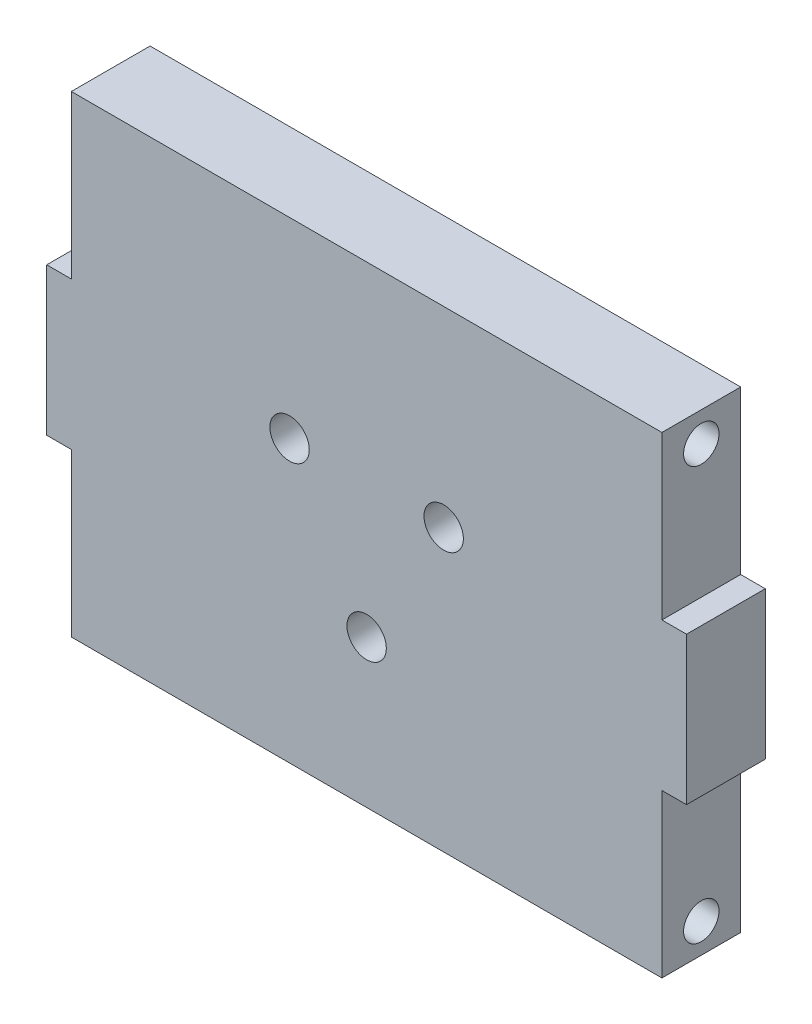
ISO-10303-21;
HEADER;
FILE_DESCRIPTION(('STEP AP214'),'2;1');
FILE_NAME('part.step','',(''),(''),'','','');
FILE_SCHEMA(('AUTOMOTIVE_DESIGN { 1 0 10303 214 1 1 1 1 }'));
ENDSEC;
DATA;
#1=APPLICATION_CONTEXT('core data for automotive mechanical design processes');
#2=APPLICATION_PROTOCOL_DEFINITION('international standard','automotive_design',2000,#1);
#3=PRODUCT_CONTEXT('',#1,'mechanical');
#4=PRODUCT('Part','Part','',(#3));
#5=PRODUCT_RELATED_PRODUCT_CATEGORY('part','',(#4));
#6=PRODUCT_DEFINITION_FORMATION('','',#4);
#7=PRODUCT_DEFINITION_CONTEXT('part definition',#1,'design');
#8=PRODUCT_DEFINITION('design','',#6,#7);
#9=PRODUCT_DEFINITION_SHAPE('','',#8);
#10=(LENGTH_UNIT() NAMED_UNIT(*) SI_UNIT(.MILLI.,.METRE.));
#11=(NAMED_UNIT(*) PLANE_ANGLE_UNIT() SI_UNIT($,.RADIAN.));
#12=(NAMED_UNIT(*) SI_UNIT($,.STERADIAN.) SOLID_ANGLE_UNIT());
#13=UNCERTAINTY_MEASURE_WITH_UNIT(LENGTH_MEASURE(1.E-05),#10,'distance_accuracy_value','');
#14=(GEOMETRIC_REPRESENTATION_CONTEXT(3) GLOBAL_UNCERTAINTY_ASSIGNED_CONTEXT((#13)) GLOBAL_UNIT_ASSIGNED_CONTEXT((#10,
#11,#12)) REPRESENTATION_CONTEXT('',''));
#15=CARTESIAN_POINT('',(0.,0.,0.));
#16=DIRECTION('',(0.,0.,1.));
#17=DIRECTION('',(1.,0.,0.));
#18=AXIS2_PLACEMENT_3D('',#15,#16,#17);
#19=CARTESIAN_POINT('',(-30.,24.,8.));
#20=DIRECTION('',(1.,0.,0.));
#21=DIRECTION('',(0.,1.,0.));
#22=AXIS2_PLACEMENT_3D('',#19,#20,#21);
#23=PLANE('',#22);
#24=CARTESIAN_POINT('',(-30.,-21.,4.));
#25=DIRECTION('',(-1.,0.,0.));
#26=DIRECTION('',(0.,-1.,0.));
#27=AXIS2_PLACEMENT_3D('',#24,#25,#26);
#28=CIRCLE('',#27,1.8);
#29=CARTESIAN_POINT('',(-30.,-22.8,4.));
#30=VERTEX_POINT('',#29);
#31=EDGE_CURVE('E290',#30,#30,#28,.T.);
#32=ORIENTED_EDGE('',*,*,#31,.F.);
#33=EDGE_LOOP('',(#32));
#34=FACE_BOUND('',#33,.T.);
#35=DIRECTION('',(0.,-1.,0.));
#36=VECTOR('',#35,1.);
#37=CARTESIAN_POINT('',(-30.,24.,8.));
#38=LINE('',#37,#36);
#39=CARTESIAN_POINT('',(-30.,-7.5,8.));
#40=VERTEX_POINT('',#39);
#41=CARTESIAN_POINT('',(-30.,-24.,8.));
#42=VERTEX_POINT('',#41);
#43=EDGE_CURVE('E202',#40,#42,#38,.T.);
#44=ORIENTED_EDGE('',*,*,#43,.F.);
#45=DIRECTION('',(0.,0.,-1.));
#46=VECTOR('',#45,1.);
#47=CARTESIAN_POINT('',(-30.,-7.5,8.));
#48=LINE('',#47,#46);
#49=CARTESIAN_POINT('',(-30.,-7.5,0.));
#50=VERTEX_POINT('',#49);
#51=EDGE_CURVE('E194',#40,#50,#48,.T.);
#52=ORIENTED_EDGE('',*,*,#51,.T.);
#53=DIRECTION('',(0.,-1.,0.));
#54=VECTOR('',#53,1.);
#55=CARTESIAN_POINT('',(-30.,24.,0.));
#56=LINE('',#55,#54);
#57=CARTESIAN_POINT('',(-30.,-24.,0.));
#58=VERTEX_POINT('',#57);
#59=EDGE_CURVE('E197',#50,#58,#56,.T.);
#60=ORIENTED_EDGE('',*,*,#59,.T.);
#61=DIRECTION('',(0.,0.,-1.));
#62=VECTOR('',#61,1.);
#63=CARTESIAN_POINT('',(-30.,-24.,8.));
#64=LINE('',#63,#62);
#65=EDGE_CURVE('E11',#42,#58,#64,.T.);
#66=ORIENTED_EDGE('',*,*,#65,.F.);
#67=EDGE_LOOP('',(#44,#52,#60,#66));
#68=FACE_BOUND('',#67,.T.);
#69=ADVANCED_FACE('F44',(#34,#68),#23,.F.);
#70=CARTESIAN_POINT('',(30.,24.,8.));
#71=DIRECTION('',(1.,0.,0.));
#72=DIRECTION('',(0.,1.,0.));
#73=AXIS2_PLACEMENT_3D('',#70,#71,#72);
#74=PLANE('',#73);
#75=CARTESIAN_POINT('',(30.,-21.,4.));
#76=DIRECTION('',(-1.,0.,0.));
#77=DIRECTION('',(0.,-1.,0.));
#78=AXIS2_PLACEMENT_3D('',#75,#76,#77);
#79=CIRCLE('',#78,1.8);
#80=CARTESIAN_POINT('',(30.,-22.8,4.));
#81=VERTEX_POINT('',#80);
#82=EDGE_CURVE('E287',#81,#81,#79,.T.);
#83=ORIENTED_EDGE('',*,*,#82,.T.);
#84=EDGE_LOOP('',(#83));
#85=FACE_BOUND('',#84,.T.);
#86=DIRECTION('',(0.,0.,-1.));
#87=VECTOR('',#86,1.);
#88=CARTESIAN_POINT('',(30.,-7.5,8.));
#89=LINE('',#88,#87);
#90=CARTESIAN_POINT('',(30.,-7.5,8.));
#91=VERTEX_POINT('',#90);
#92=CARTESIAN_POINT('',(30.,-7.5,0.));
#93=VERTEX_POINT('',#92);
#94=EDGE_CURVE('E191',#91,#93,#89,.T.);
#95=ORIENTED_EDGE('',*,*,#94,.F.);
#96=DIRECTION('',(0.,-1.,0.));
#97=VECTOR('',#96,1.);
#98=CARTESIAN_POINT('',(30.,24.,8.));
#99=LINE('',#98,#97);
#100=CARTESIAN_POINT('',(30.,-24.,8.));
#101=VERTEX_POINT('',#100);
#102=EDGE_CURVE('E205',#91,#101,#99,.T.);
#103=ORIENTED_EDGE('',*,*,#102,.T.);
#104=DIRECTION('',(0.,0.,-1.));
#105=VECTOR('',#104,1.);
#106=CARTESIAN_POINT('',(30.,-24.,8.));
#107=LINE('',#106,#105);
#108=CARTESIAN_POINT('',(30.,-24.,0.));
#109=VERTEX_POINT('',#108);
#110=EDGE_CURVE('E52',#101,#109,#107,.T.);
#111=ORIENTED_EDGE('',*,*,#110,.T.);
#112=DIRECTION('',(0.,-1.,0.));
#113=VECTOR('',#112,1.);
#114=CARTESIAN_POINT('',(30.,24.,0.));
#115=LINE('',#114,#113);
#116=EDGE_CURVE('E217',#93,#109,#115,.T.);
#117=ORIENTED_EDGE('',*,*,#116,.F.);
#118=EDGE_LOOP('',(#95,#103,#111,#117));
#119=FACE_BOUND('',#118,.T.);
#120=ADVANCED_FACE('F227',(#85,#119),#74,.T.);
#121=CARTESIAN_POINT('',(-30.,21.,4.));
#122=DIRECTION('',(1.,0.,0.));
#123=DIRECTION('',(0.,1.,0.));
#124=AXIS2_PLACEMENT_3D('',#121,#122,#123);
#125=CIRCLE('',#124,1.8);
#126=CARTESIAN_POINT('',(-30.,22.8,4.));
#127=VERTEX_POINT('',#126);
#128=EDGE_CURVE('E281',#127,#127,#125,.T.);
#129=ORIENTED_EDGE('',*,*,#128,.T.);
#130=EDGE_LOOP('',(#129));
#131=FACE_BOUND('',#130,.T.);
#132=CARTESIAN_POINT('',(-30.,24.,0.));
#133=VERTEX_POINT('',#132);
#134=CARTESIAN_POINT('',(-30.,7.5,0.));
#135=VERTEX_POINT('',#134);
#136=EDGE_CURVE('E211',#133,#135,#56,.T.);
#137=ORIENTED_EDGE('',*,*,#136,.T.);
#138=DIRECTION('',(0.,0.,1.));
#139=VECTOR('',#138,1.);
#140=CARTESIAN_POINT('',(-30.,7.5,8.));
#141=LINE('',#140,#139);
#142=CARTESIAN_POINT('',(-30.,7.5,8.));
#143=VERTEX_POINT('',#142);
#144=EDGE_CURVE('E188',#135,#143,#141,.T.);
#145=ORIENTED_EDGE('',*,*,#144,.T.);
#146=CARTESIAN_POINT('',(-30.,24.,8.));
#147=VERTEX_POINT('',#146);
#148=EDGE_CURVE('E198',#147,#143,#38,.T.);
#149=ORIENTED_EDGE('',*,*,#148,.F.);
#150=DIRECTION('',(0.,0.,-1.));
#151=VECTOR('',#150,1.);
#152=CARTESIAN_POINT('',(-30.,24.,8.));
#153=LINE('',#152,#151);
#154=EDGE_CURVE('E210',#147,#133,#153,.T.);
#155=ORIENTED_EDGE('',*,*,#154,.T.);
#156=EDGE_LOOP('',(#137,#145,#149,#155));
#157=FACE_BOUND('',#156,.T.);
#158=ADVANCED_FACE('F46',(#131,#157),#23,.F.);
#159=CARTESIAN_POINT('',(-30.,-24.,8.));
#160=DIRECTION('',(0.,1.,0.));
#161=DIRECTION('',(0.,0.,1.));
#162=AXIS2_PLACEMENT_3D('',#159,#160,#161);
#163=PLANE('',#162);
#164=DIRECTION('',(1.,0.,0.));
#165=VECTOR('',#164,1.);
#166=CARTESIAN_POINT('',(-30.,-24.,0.));
#167=LINE('',#166,#165);
#168=EDGE_CURVE('E214',#58,#109,#167,.T.);
#169=ORIENTED_EDGE('',*,*,#168,.T.);
#170=ORIENTED_EDGE('',*,*,#110,.F.);
#171=DIRECTION('',(1.,0.,0.));
#172=VECTOR('',#171,1.);
#173=CARTESIAN_POINT('',(-30.,-24.,8.));
#174=LINE('',#173,#172);
#175=EDGE_CURVE('E201',#42,#101,#174,.T.);
#176=ORIENTED_EDGE('',*,*,#175,.F.);
#177=ORIENTED_EDGE('',*,*,#65,.T.);
#178=EDGE_LOOP('',(#169,#170,#176,#177));
#179=FACE_BOUND('',#178,.T.);
#180=ADVANCED_FACE('F231',(#179),#163,.F.);
#181=CARTESIAN_POINT('',(30.,21.,4.));
#182=DIRECTION('',(1.,0.,0.));
#183=DIRECTION('',(0.,1.,0.));
#184=AXIS2_PLACEMENT_3D('',#181,#182,#183);
#185=CIRCLE('',#184,1.8);
#186=CARTESIAN_POINT('',(30.,22.8,4.));
#187=VERTEX_POINT('',#186);
#188=EDGE_CURVE('E297',#187,#187,#185,.T.);
#189=ORIENTED_EDGE('',*,*,#188,.F.);
#190=EDGE_LOOP('',(#189));
#191=FACE_BOUND('',#190,.T.);
#192=DIRECTION('',(0.,0.,1.));
#193=VECTOR('',#192,1.);
#194=CARTESIAN_POINT('',(30.,7.5,8.));
#195=LINE('',#194,#193);
#196=CARTESIAN_POINT('',(30.,7.5,0.));
#197=VERTEX_POINT('',#196);
#198=CARTESIAN_POINT('',(30.,7.5,8.));
#199=VERTEX_POINT('',#198);
#200=EDGE_CURVE('E182',#197,#199,#195,.T.);
#201=ORIENTED_EDGE('',*,*,#200,.F.);
#202=CARTESIAN_POINT('',(30.,24.,0.));
#203=VERTEX_POINT('',#202);
#204=EDGE_CURVE('E155',#203,#197,#115,.T.);
#205=ORIENTED_EDGE('',*,*,#204,.F.);
#206=DIRECTION('',(0.,0.,-1.));
#207=VECTOR('',#206,1.);
#208=CARTESIAN_POINT('',(30.,24.,8.));
#209=LINE('',#208,#207);
#210=CARTESIAN_POINT('',(30.,24.,8.));
#211=VERTEX_POINT('',#210);
#212=EDGE_CURVE('E222',#211,#203,#209,.T.);
#213=ORIENTED_EDGE('',*,*,#212,.F.);
#214=EDGE_CURVE('E59',#211,#199,#99,.T.);
#215=ORIENTED_EDGE('',*,*,#214,.T.);
#216=EDGE_LOOP('',(#201,#205,#213,#215));
#217=FACE_BOUND('',#216,.T.);
#218=ADVANCED_FACE('F258',(#191,#217),#74,.T.);
#219=CARTESIAN_POINT('',(-30.,24.,8.));
#220=DIRECTION('',(0.,1.,0.));
#221=DIRECTION('',(-1.,0.,0.));
#222=AXIS2_PLACEMENT_3D('',#219,#220,#221);
#223=PLANE('',#222);
#224=DIRECTION('',(1.,0.,0.));
#225=VECTOR('',#224,1.);
#226=CARTESIAN_POINT('',(-30.,24.,0.));
#227=LINE('',#226,#225);
#228=EDGE_CURVE('E219',#133,#203,#227,.T.);
#229=ORIENTED_EDGE('',*,*,#228,.F.);
#230=ORIENTED_EDGE('',*,*,#154,.F.);
#231=DIRECTION('',(1.,0.,0.));
#232=VECTOR('',#231,1.);
#233=CARTESIAN_POINT('',(-30.,24.,8.));
#234=LINE('',#233,#232);
#235=EDGE_CURVE('E207',#147,#211,#234,.T.);
#236=ORIENTED_EDGE('',*,*,#235,.T.);
#237=ORIENTED_EDGE('',*,*,#212,.T.);
#238=EDGE_LOOP('',(#229,#230,#236,#237));
#239=FACE_BOUND('',#238,.T.);
#240=ADVANCED_FACE('F257',(#239),#223,.T.);
#241=CARTESIAN_POINT('',(0.,0.,8.));
#242=DIRECTION('',(0.,0.,1.));
#243=DIRECTION('',(1.,0.,0.));
#244=AXIS2_PLACEMENT_3D('',#241,#242,#243);
#245=PLANE('',#244);
#246=CARTESIAN_POINT('',(7.82751576233718,4.55765499741428,8.));
#247=DIRECTION('',(0.,0.,1.));
#248=DIRECTION('',(-0.500000000000004,0.866025403784436,0.));
#249=AXIS2_PLACEMENT_3D('',#246,#247,#248);
#250=CIRCLE('',#249,2.);
#251=CARTESIAN_POINT('',(6.82751576233717,6.28970580498315,8.));
#252=VERTEX_POINT('',#251);
#253=EDGE_CURVE('E309',#252,#252,#250,.T.);
#254=ORIENTED_EDGE('',*,*,#253,.F.);
#255=EDGE_LOOP('',(#254));
#256=FACE_BOUND('',#255,.T.);
#257=CARTESIAN_POINT('',(-7.82751576233722,4.55765499741418,8.));
#258=DIRECTION('',(0.,0.,1.));
#259=DIRECTION('',(-0.499999999999992,-0.866025403784443,0.));
#260=AXIS2_PLACEMENT_3D('',#257,#258,#259);
#261=CIRCLE('',#260,2.);
#262=CARTESIAN_POINT('',(-8.8275157623372,2.82560418984529,8.));
#263=VERTEX_POINT('',#262);
#264=EDGE_CURVE('E303',#263,#263,#261,.T.);
#265=ORIENTED_EDGE('',*,*,#264,.F.);
#266=EDGE_LOOP('',(#265));
#267=FACE_BOUND('',#266,.T.);
#268=CARTESIAN_POINT('',(0.,-9.,8.));
#269=DIRECTION('',(0.,0.,1.));
#270=DIRECTION('',(1.,0.,0.));
#271=AXIS2_PLACEMENT_3D('',#268,#269,#270);
#272=CIRCLE('',#271,2.);
#273=CARTESIAN_POINT('',(2.,-9.,8.));
#274=VERTEX_POINT('',#273);
#275=EDGE_CURVE('E167',#274,#274,#272,.T.);
#276=ORIENTED_EDGE('',*,*,#275,.F.);
#277=EDGE_LOOP('',(#276));
#278=FACE_BOUND('',#277,.T.);
#279=ORIENTED_EDGE('',*,*,#148,.T.);
#280=DIRECTION('',(-1.,0.,0.));
#281=VECTOR('',#280,1.);
#282=CARTESIAN_POINT('',(-32.5,7.5,8.));
#283=LINE('',#282,#281);
#284=CARTESIAN_POINT('',(-32.5,7.5,8.));
#285=VERTEX_POINT('',#284);
#286=EDGE_CURVE('E176',#143,#285,#283,.T.);
#287=ORIENTED_EDGE('',*,*,#286,.T.);
#288=DIRECTION('',(0.,-1.,0.));
#289=VECTOR('',#288,1.);
#290=CARTESIAN_POINT('',(-32.5,7.5,8.));
#291=LINE('',#290,#289);
#292=CARTESIAN_POINT('',(-32.5,-7.5,8.));
#293=VERTEX_POINT('',#292);
#294=EDGE_CURVE('E179',#285,#293,#291,.T.);
#295=ORIENTED_EDGE('',*,*,#294,.T.);
#296=DIRECTION('',(1.,0.,0.));
#297=VECTOR('',#296,1.);
#298=CARTESIAN_POINT('',(-32.5,-7.5,8.));
#299=LINE('',#298,#297);
#300=EDGE_CURVE('E67',#293,#40,#299,.T.);
#301=ORIENTED_EDGE('',*,*,#300,.T.);
#302=ORIENTED_EDGE('',*,*,#43,.T.);
#303=ORIENTED_EDGE('',*,*,#175,.T.);
#304=ORIENTED_EDGE('',*,*,#102,.F.);
#305=CARTESIAN_POINT('',(32.5,-7.5,8.));
#306=VERTEX_POINT('',#305);
#307=EDGE_CURVE('E164',#91,#306,#299,.T.);
#308=ORIENTED_EDGE('',*,*,#307,.T.);
#309=DIRECTION('',(0.,1.,0.));
#310=VECTOR('',#309,1.);
#311=CARTESIAN_POINT('',(32.5,7.5,8.));
#312=LINE('',#311,#310);
#313=CARTESIAN_POINT('',(32.5,7.5,8.));
#314=VERTEX_POINT('',#313);
#315=EDGE_CURVE('E174',#306,#314,#312,.T.);
#316=ORIENTED_EDGE('',*,*,#315,.T.);
#317=EDGE_CURVE('E139',#314,#199,#283,.T.);
#318=ORIENTED_EDGE('',*,*,#317,.T.);
#319=ORIENTED_EDGE('',*,*,#214,.F.);
#320=ORIENTED_EDGE('',*,*,#235,.F.);
#321=EDGE_LOOP('',(#279,#287,#295,#301,#302,#303,#304,#308,#316,#318,#319,#320));
#322=FACE_BOUND('',#321,.T.);
#323=ADVANCED_FACE('F238',(#256,#267,#278,#322),#245,.T.);
#324=CARTESIAN_POINT('',(0.,0.,0.));
#325=DIRECTION('',(0.,0.,1.));
#326=DIRECTION('',(1.,0.,0.));
#327=AXIS2_PLACEMENT_3D('',#324,#325,#326);
#328=PLANE('',#327);
#329=CARTESIAN_POINT('',(7.82751576233718,4.55765499741428,0.));
#330=DIRECTION('',(0.,0.,1.));
#331=DIRECTION('',(-0.500000000000004,0.866025403784436,0.));
#332=AXIS2_PLACEMENT_3D('',#329,#330,#331);
#333=CIRCLE('',#332,2.);
#334=CARTESIAN_POINT('',(6.82751576233717,6.28970580498315,0.));
#335=VERTEX_POINT('',#334);
#336=EDGE_CURVE('E306',#335,#335,#333,.T.);
#337=ORIENTED_EDGE('',*,*,#336,.T.);
#338=EDGE_LOOP('',(#337));
#339=FACE_BOUND('',#338,.T.);
#340=CARTESIAN_POINT('',(-7.82751576233722,4.55765499741418,0.));
#341=DIRECTION('',(0.,0.,1.));
#342=DIRECTION('',(-0.499999999999992,-0.866025403784443,0.));
#343=AXIS2_PLACEMENT_3D('',#340,#341,#342);
#344=CIRCLE('',#343,2.);
#345=CARTESIAN_POINT('',(-8.8275157623372,2.82560418984529,0.));
#346=VERTEX_POINT('',#345);
#347=EDGE_CURVE('E312',#346,#346,#344,.T.);
#348=ORIENTED_EDGE('',*,*,#347,.T.);
#349=EDGE_LOOP('',(#348));
#350=FACE_BOUND('',#349,.T.);
#351=CARTESIAN_POINT('',(0.,-9.,0.));
#352=DIRECTION('',(0.,0.,1.));
#353=DIRECTION('',(1.,0.,0.));
#354=AXIS2_PLACEMENT_3D('',#351,#352,#353);
#355=CIRCLE('',#354,2.);
#356=CARTESIAN_POINT('',(2.,-9.,0.));
#357=VERTEX_POINT('',#356);
#358=EDGE_CURVE('E177',#357,#357,#355,.T.);
#359=ORIENTED_EDGE('',*,*,#358,.T.);
#360=EDGE_LOOP('',(#359));
#361=FACE_BOUND('',#360,.T.);
#362=ORIENTED_EDGE('',*,*,#204,.T.);
#363=DIRECTION('',(-1.,0.,0.));
#364=VECTOR('',#363,1.);
#365=CARTESIAN_POINT('',(-32.5,7.5,0.));
#366=LINE('',#365,#364);
#367=CARTESIAN_POINT('',(32.5,7.5,0.));
#368=VERTEX_POINT('',#367);
#369=EDGE_CURVE('E137',#368,#197,#366,.T.);
#370=ORIENTED_EDGE('',*,*,#369,.F.);
#371=DIRECTION('',(0.,1.,0.));
#372=VECTOR('',#371,1.);
#373=CARTESIAN_POINT('',(32.5,7.5,0.));
#374=LINE('',#373,#372);
#375=CARTESIAN_POINT('',(32.5,-7.5,0.));
#376=VERTEX_POINT('',#375);
#377=EDGE_CURVE('E152',#376,#368,#374,.T.);
#378=ORIENTED_EDGE('',*,*,#377,.F.);
#379=DIRECTION('',(1.,0.,0.));
#380=VECTOR('',#379,1.);
#381=CARTESIAN_POINT('',(-32.5,-7.5,0.));
#382=LINE('',#381,#380);
#383=EDGE_CURVE('E172',#93,#376,#382,.T.);
#384=ORIENTED_EDGE('',*,*,#383,.F.);
#385=ORIENTED_EDGE('',*,*,#116,.T.);
#386=ORIENTED_EDGE('',*,*,#168,.F.);
#387=ORIENTED_EDGE('',*,*,#59,.F.);
#388=CARTESIAN_POINT('',(-32.5,-7.5,0.));
#389=VERTEX_POINT('',#388);
#390=EDGE_CURVE('E145',#389,#50,#382,.T.);
#391=ORIENTED_EDGE('',*,*,#390,.F.);
#392=DIRECTION('',(0.,-1.,0.));
#393=VECTOR('',#392,1.);
#394=CARTESIAN_POINT('',(-32.5,7.5,0.));
#395=LINE('',#394,#393);
#396=CARTESIAN_POINT('',(-32.5,7.5,0.));
#397=VERTEX_POINT('',#396);
#398=EDGE_CURVE('E156',#397,#389,#395,.T.);
#399=ORIENTED_EDGE('',*,*,#398,.F.);
#400=EDGE_CURVE('E157',#135,#397,#366,.T.);
#401=ORIENTED_EDGE('',*,*,#400,.F.);
#402=ORIENTED_EDGE('',*,*,#136,.F.);
#403=ORIENTED_EDGE('',*,*,#228,.T.);
#404=EDGE_LOOP('',(#362,#370,#378,#384,#385,#386,#387,#391,#399,#401,#402,#403));
#405=FACE_BOUND('',#404,.T.);
#406=ADVANCED_FACE('F150',(#339,#350,#361,#405),#328,.F.);
#407=CARTESIAN_POINT('',(32.5,7.5,0.));
#408=DIRECTION('',(1.,0.,0.));
#409=DIRECTION('',(0.,0.,-1.));
#410=AXIS2_PLACEMENT_3D('',#407,#408,#409);
#411=PLANE('',#410);
#412=ORIENTED_EDGE('',*,*,#315,.F.);
#413=DIRECTION('',(0.,0.,1.));
#414=VECTOR('',#413,1.);
#415=CARTESIAN_POINT('',(32.5,-7.5,0.));
#416=LINE('',#415,#414);
#417=EDGE_CURVE('E162',#376,#306,#416,.T.);
#418=ORIENTED_EDGE('',*,*,#417,.F.);
#419=ORIENTED_EDGE('',*,*,#377,.T.);
#420=DIRECTION('',(0.,0.,1.));
#421=VECTOR('',#420,1.);
#422=CARTESIAN_POINT('',(32.5,7.5,0.));
#423=LINE('',#422,#421);
#424=EDGE_CURVE('E134',#368,#314,#423,.T.);
#425=ORIENTED_EDGE('',*,*,#424,.T.);
#426=EDGE_LOOP('',(#412,#418,#419,#425));
#427=FACE_BOUND('',#426,.T.);
#428=ADVANCED_FACE('F160',(#427),#411,.T.);
#429=CARTESIAN_POINT('',(-32.5,7.5,0.));
#430=DIRECTION('',(0.,1.,0.));
#431=DIRECTION('',(0.,0.,1.));
#432=AXIS2_PLACEMENT_3D('',#429,#430,#431);
#433=PLANE('',#432);
#434=ORIENTED_EDGE('',*,*,#369,.T.);
#435=ORIENTED_EDGE('',*,*,#200,.T.);
#436=ORIENTED_EDGE('',*,*,#317,.F.);
#437=ORIENTED_EDGE('',*,*,#424,.F.);
#438=EDGE_LOOP('',(#434,#435,#436,#437));
#439=FACE_BOUND('',#438,.T.);
#440=ADVANCED_FACE('F136',(#439),#433,.T.);
#441=CARTESIAN_POINT('',(-32.5,-7.5,0.));
#442=DIRECTION('',(0.,-1.,0.));
#443=DIRECTION('',(0.,0.,-1.));
#444=AXIS2_PLACEMENT_3D('',#441,#442,#443);
#445=PLANE('',#444);
#446=ORIENTED_EDGE('',*,*,#307,.F.);
#447=ORIENTED_EDGE('',*,*,#94,.T.);
#448=ORIENTED_EDGE('',*,*,#383,.T.);
#449=ORIENTED_EDGE('',*,*,#417,.T.);
#450=EDGE_LOOP('',(#446,#447,#448,#449));
#451=FACE_BOUND('',#450,.T.);
#452=ADVANCED_FACE('F237',(#451),#445,.T.);
#453=ORIENTED_EDGE('',*,*,#51,.F.);
#454=ORIENTED_EDGE('',*,*,#300,.F.);
#455=DIRECTION('',(0.,0.,1.));
#456=VECTOR('',#455,1.);
#457=CARTESIAN_POINT('',(-32.5,-7.5,0.));
#458=LINE('',#457,#456);
#459=EDGE_CURVE('E183',#389,#293,#458,.T.);
#460=ORIENTED_EDGE('',*,*,#459,.F.);
#461=ORIENTED_EDGE('',*,*,#390,.T.);
#462=EDGE_LOOP('',(#453,#454,#460,#461));
#463=FACE_BOUND('',#462,.T.);
#464=ADVANCED_FACE('F242',(#463),#445,.T.);
#465=ORIENTED_EDGE('',*,*,#144,.F.);
#466=ORIENTED_EDGE('',*,*,#400,.T.);
#467=DIRECTION('',(0.,0.,1.));
#468=VECTOR('',#467,1.);
#469=CARTESIAN_POINT('',(-32.5,7.5,0.));
#470=LINE('',#469,#468);
#471=EDGE_CURVE('E144',#397,#285,#470,.T.);
#472=ORIENTED_EDGE('',*,*,#471,.T.);
#473=ORIENTED_EDGE('',*,*,#286,.F.);
#474=EDGE_LOOP('',(#465,#466,#472,#473));
#475=FACE_BOUND('',#474,.T.);
#476=ADVANCED_FACE('F251',(#475),#433,.T.);
#477=CARTESIAN_POINT('',(-32.5,7.5,0.));
#478=DIRECTION('',(-1.,0.,0.));
#479=DIRECTION('',(0.,0.,1.));
#480=AXIS2_PLACEMENT_3D('',#477,#478,#479);
#481=PLANE('',#480);
#482=ORIENTED_EDGE('',*,*,#294,.F.);
#483=ORIENTED_EDGE('',*,*,#471,.F.);
#484=ORIENTED_EDGE('',*,*,#398,.T.);
#485=ORIENTED_EDGE('',*,*,#459,.T.);
#486=EDGE_LOOP('',(#482,#483,#484,#485));
#487=FACE_BOUND('',#486,.T.);
#488=ADVANCED_FACE('F249',(#487),#481,.T.);
#489=CARTESIAN_POINT('',(0.,-9.,0.));
#490=DIRECTION('',(0.,0.,1.));
#491=DIRECTION('',(1.,0.,0.));
#492=AXIS2_PLACEMENT_3D('',#489,#490,#491);
#493=CYLINDRICAL_SURFACE('',#492,2.);
#494=ORIENTED_EDGE('',*,*,#358,.F.);
#495=EDGE_LOOP('',(#494));
#496=FACE_BOUND('',#495,.T.);
#497=ORIENTED_EDGE('',*,*,#275,.T.);
#498=EDGE_LOOP('',(#497));
#499=FACE_BOUND('',#498,.T.);
#500=ADVANCED_FACE('F322',(#496,#499),#493,.F.);
#501=CARTESIAN_POINT('',(-7.82751576233722,4.55765499741418,0.));
#502=DIRECTION('',(0.,0.,1.));
#503=DIRECTION('',(1.,0.,0.));
#504=AXIS2_PLACEMENT_3D('',#501,#502,#503);
#505=CYLINDRICAL_SURFACE('',#504,2.);
#506=ORIENTED_EDGE('',*,*,#347,.F.);
#507=EDGE_LOOP('',(#506));
#508=FACE_BOUND('',#507,.T.);
#509=ORIENTED_EDGE('',*,*,#264,.T.);
#510=EDGE_LOOP('',(#509));
#511=FACE_BOUND('',#510,.T.);
#512=ADVANCED_FACE('F345',(#508,#511),#505,.F.);
#513=CARTESIAN_POINT('',(7.82751576233718,4.55765499741428,0.));
#514=DIRECTION('',(0.,0.,1.));
#515=DIRECTION('',(1.,0.,0.));
#516=AXIS2_PLACEMENT_3D('',#513,#514,#515);
#517=CYLINDRICAL_SURFACE('',#516,2.);
#518=ORIENTED_EDGE('',*,*,#336,.F.);
#519=EDGE_LOOP('',(#518));
#520=FACE_BOUND('',#519,.T.);
#521=ORIENTED_EDGE('',*,*,#253,.T.);
#522=EDGE_LOOP('',(#521));
#523=FACE_BOUND('',#522,.T.);
#524=ADVANCED_FACE('F349',(#520,#523),#517,.F.);
#525=CARTESIAN_POINT('',(27.,21.,4.));
#526=DIRECTION('',(1.,0.,0.));
#527=DIRECTION('',(0.,1.,0.));
#528=AXIS2_PLACEMENT_3D('',#525,#526,#527);
#529=CYLINDRICAL_SURFACE('',#528,1.8);
#530=CARTESIAN_POINT('',(27.,21.,4.));
#531=DIRECTION('',(1.,0.,0.));
#532=DIRECTION('',(0.,1.,0.));
#533=AXIS2_PLACEMENT_3D('',#530,#531,#532);
#534=CIRCLE('',#533,1.8);
#535=CARTESIAN_POINT('',(27.,22.8,4.));
#536=VERTEX_POINT('',#535);
#537=EDGE_CURVE('E300',#536,#536,#534,.T.);
#538=ORIENTED_EDGE('',*,*,#537,.F.);
#539=EDGE_LOOP('',(#538));
#540=FACE_BOUND('',#539,.T.);
#541=ORIENTED_EDGE('',*,*,#188,.T.);
#542=EDGE_LOOP('',(#541));
#543=FACE_BOUND('',#542,.T.);
#544=ADVANCED_FACE('F353',(#540,#543),#529,.F.);
#545=CARTESIAN_POINT('',(27.,21.,4.));
#546=DIRECTION('',(1.,0.,0.));
#547=DIRECTION('',(0.,1.,0.));
#548=AXIS2_PLACEMENT_3D('',#545,#546,#547);
#549=PLANE('',#548);
#550=ORIENTED_EDGE('',*,*,#537,.T.);
#551=EDGE_LOOP('',(#550));
#552=FACE_BOUND('',#551,.T.);
#553=ADVANCED_FACE('F357',(#552),#549,.T.);
#554=CARTESIAN_POINT('',(27.,-21.,4.));
#555=DIRECTION('',(1.,0.,0.));
#556=DIRECTION('',(0.,1.,0.));
#557=AXIS2_PLACEMENT_3D('',#554,#555,#556);
#558=CYLINDRICAL_SURFACE('',#557,1.8);
#559=CARTESIAN_POINT('',(27.,-21.,4.));
#560=DIRECTION('',(-1.,0.,0.));
#561=DIRECTION('',(0.,-1.,0.));
#562=AXIS2_PLACEMENT_3D('',#559,#560,#561);
#563=CIRCLE('',#562,1.8);
#564=CARTESIAN_POINT('',(27.,-22.8,4.));
#565=VERTEX_POINT('',#564);
#566=EDGE_CURVE('E294',#565,#565,#563,.T.);
#567=ORIENTED_EDGE('',*,*,#566,.T.);
#568=EDGE_LOOP('',(#567));
#569=FACE_BOUND('',#568,.T.);
#570=ORIENTED_EDGE('',*,*,#82,.F.);
#571=EDGE_LOOP('',(#570));
#572=FACE_BOUND('',#571,.T.);
#573=ADVANCED_FACE('F361',(#569,#572),#558,.F.);
#574=CARTESIAN_POINT('',(27.,-21.,4.));
#575=DIRECTION('',(1.,0.,0.));
#576=DIRECTION('',(0.,-1.,0.));
#577=AXIS2_PLACEMENT_3D('',#574,#575,#576);
#578=PLANE('',#577);
#579=ORIENTED_EDGE('',*,*,#566,.F.);
#580=EDGE_LOOP('',(#579));
#581=FACE_BOUND('',#580,.T.);
#582=ADVANCED_FACE('F365',(#581),#578,.T.);
#583=CARTESIAN_POINT('',(-27.,21.,4.));
#584=DIRECTION('',(-1.,0.,0.));
#585=DIRECTION('',(0.,-1.,0.));
#586=AXIS2_PLACEMENT_3D('',#583,#584,#585);
#587=CYLINDRICAL_SURFACE('',#586,1.8);
#588=CARTESIAN_POINT('',(-27.,21.,4.));
#589=DIRECTION('',(1.,0.,0.));
#590=DIRECTION('',(0.,1.,0.));
#591=AXIS2_PLACEMENT_3D('',#588,#589,#590);
#592=CIRCLE('',#591,1.8);
#593=CARTESIAN_POINT('',(-27.,22.8,4.));
#594=VERTEX_POINT('',#593);
#595=EDGE_CURVE('E283',#594,#594,#592,.T.);
#596=ORIENTED_EDGE('',*,*,#595,.T.);
#597=EDGE_LOOP('',(#596));
#598=FACE_BOUND('',#597,.T.);
#599=ORIENTED_EDGE('',*,*,#128,.F.);
#600=EDGE_LOOP('',(#599));
#601=FACE_BOUND('',#600,.T.);
#602=ADVANCED_FACE('F369',(#598,#601),#587,.F.);
#603=CARTESIAN_POINT('',(-27.,21.,4.));
#604=DIRECTION('',(-1.,0.,0.));
#605=DIRECTION('',(0.,1.,0.));
#606=AXIS2_PLACEMENT_3D('',#603,#604,#605);
#607=PLANE('',#606);
#608=ORIENTED_EDGE('',*,*,#595,.F.);
#609=EDGE_LOOP('',(#608));
#610=FACE_BOUND('',#609,.T.);
#611=ADVANCED_FACE('F373',(#610),#607,.T.);
#612=CARTESIAN_POINT('',(-27.,-21.,4.));
#613=DIRECTION('',(-1.,0.,0.));
#614=DIRECTION('',(0.,-1.,0.));
#615=AXIS2_PLACEMENT_3D('',#612,#613,#614);
#616=CYLINDRICAL_SURFACE('',#615,1.8);
#617=CARTESIAN_POINT('',(-27.,-21.,4.));
#618=DIRECTION('',(-1.,0.,0.));
#619=DIRECTION('',(0.,-1.,0.));
#620=AXIS2_PLACEMENT_3D('',#617,#618,#619);
#621=CIRCLE('',#620,1.8);
#622=CARTESIAN_POINT('',(-27.,-22.8,4.));
#623=VERTEX_POINT('',#622);
#624=EDGE_CURVE('E284',#623,#623,#621,.T.);
#625=ORIENTED_EDGE('',*,*,#624,.F.);
#626=EDGE_LOOP('',(#625));
#627=FACE_BOUND('',#626,.T.);
#628=ORIENTED_EDGE('',*,*,#31,.T.);
#629=EDGE_LOOP('',(#628));
#630=FACE_BOUND('',#629,.T.);
#631=ADVANCED_FACE('F377',(#627,#630),#616,.F.);
#632=CARTESIAN_POINT('',(-27.,-21.,4.));
#633=DIRECTION('',(-1.,0.,0.));
#634=DIRECTION('',(0.,-1.,0.));
#635=AXIS2_PLACEMENT_3D('',#632,#633,#634);
#636=PLANE('',#635);
#637=ORIENTED_EDGE('',*,*,#624,.T.);
#638=EDGE_LOOP('',(#637));
#639=FACE_BOUND('',#638,.T.);
#640=ADVANCED_FACE('F381',(#639),#636,.T.);
#641=CLOSED_SHELL('',(#69,#120,#158,#180,#218,#240,#323,#406,#428,#440,#452,#464,#476,#488,#500,
#512,#524,#544,#553,#573,#582,#602,#611,#631,#640));
#642=MANIFOLD_SOLID_BREP('B2',#641);
#643=ADVANCED_BREP_SHAPE_REPRESENTATION('',(#18,#642),#14);
#644=SHAPE_DEFINITION_REPRESENTATION(#9,#643);
ENDSEC;
END-ISO-10303-21;
